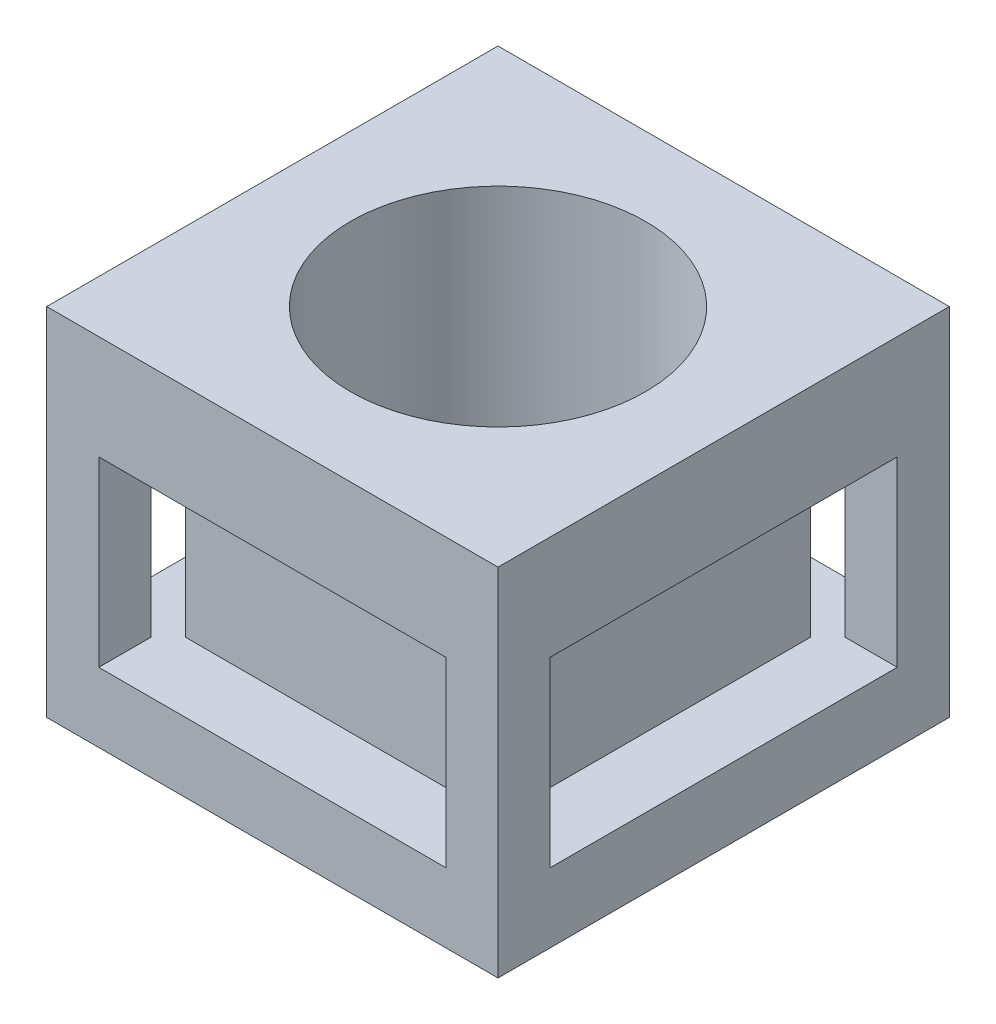
ISO-10303-21;
HEADER;
FILE_DESCRIPTION(('STEP AP214'),'2;1');
FILE_NAME('part.step','',(''),(''),'','','');
FILE_SCHEMA(('AUTOMOTIVE_DESIGN { 1 0 10303 214 1 1 1 1 }'));
ENDSEC;
DATA;
#1=APPLICATION_CONTEXT('core data for automotive mechanical design processes');
#2=APPLICATION_PROTOCOL_DEFINITION('international standard','automotive_design',2000,#1);
#3=PRODUCT_CONTEXT('',#1,'mechanical');
#4=PRODUCT('Part','Part','',(#3));
#5=PRODUCT_RELATED_PRODUCT_CATEGORY('part','',(#4));
#6=PRODUCT_DEFINITION_FORMATION('','',#4);
#7=PRODUCT_DEFINITION_CONTEXT('part definition',#1,'design');
#8=PRODUCT_DEFINITION('design','',#6,#7);
#9=PRODUCT_DEFINITION_SHAPE('','',#8);
#10=(LENGTH_UNIT() NAMED_UNIT(*) SI_UNIT(.MILLI.,.METRE.));
#11=(NAMED_UNIT(*) PLANE_ANGLE_UNIT() SI_UNIT($,.RADIAN.));
#12=(NAMED_UNIT(*) SI_UNIT($,.STERADIAN.) SOLID_ANGLE_UNIT());
#13=UNCERTAINTY_MEASURE_WITH_UNIT(LENGTH_MEASURE(1.E-05),#10,'distance_accuracy_value','');
#14=(GEOMETRIC_REPRESENTATION_CONTEXT(3) GLOBAL_UNCERTAINTY_ASSIGNED_CONTEXT((#13)) GLOBAL_UNIT_ASSIGNED_CONTEXT((#10,
#11,#12)) REPRESENTATION_CONTEXT('',''));
#15=CARTESIAN_POINT('',(0.,0.,0.));
#16=DIRECTION('',(0.,0.,1.));
#17=DIRECTION('',(1.,0.,0.));
#18=AXIS2_PLACEMENT_3D('',#15,#16,#17);
#19=CARTESIAN_POINT('',(0.,0.,26.));
#20=DIRECTION('',(1.,0.,0.));
#21=DIRECTION('',(0.,0.,-1.));
#22=AXIS2_PLACEMENT_3D('',#19,#20,#21);
#23=PLANE('',#22);
#24=DIRECTION('',(0.,0.,-1.));
#25=VECTOR('',#24,1.);
#26=CARTESIAN_POINT('',(1.04083408558608E-13,14.5,23.0000000000001));
#27=LINE('',#26,#25);
#28=CARTESIAN_POINT('',(1.04083408558608E-13,14.5,23.0000000000001));
#29=VERTEX_POINT('',#28);
#30=CARTESIAN_POINT('',(0.,14.5,3.00000000000014));
#31=VERTEX_POINT('',#30);
#32=EDGE_CURVE('E47',#29,#31,#27,.T.);
#33=ORIENTED_EDGE('',*,*,#32,.F.);
#34=DIRECTION('',(0.,1.,0.));
#35=VECTOR('',#34,1.);
#36=CARTESIAN_POINT('',(1.04083408558608E-13,14.5,23.0000000000001));
#37=LINE('',#36,#35);
#38=CARTESIAN_POINT('',(1.04083408558608E-13,4.,23.0000000000001));
#39=VERTEX_POINT('',#38);
#40=EDGE_CURVE('E182',#39,#29,#37,.T.);
#41=ORIENTED_EDGE('',*,*,#40,.F.);
#42=DIRECTION('',(0.,0.,1.));
#43=VECTOR('',#42,1.);
#44=CARTESIAN_POINT('',(1.04083408558608E-13,4.,23.0000000000001));
#45=LINE('',#44,#43);
#46=CARTESIAN_POINT('',(-1.04083408558608E-13,4.,3.00000000000014));
#47=VERTEX_POINT('',#46);
#48=EDGE_CURVE('E195',#47,#39,#45,.T.);
#49=ORIENTED_EDGE('',*,*,#48,.F.);
#50=DIRECTION('',(0.,-1.,0.));
#51=VECTOR('',#50,1.);
#52=CARTESIAN_POINT('',(-1.04083408558608E-13,14.5,3.00000000000014));
#53=LINE('',#52,#51);
#54=EDGE_CURVE('E193',#31,#47,#53,.T.);
#55=ORIENTED_EDGE('',*,*,#54,.F.);
#56=EDGE_LOOP('',(#33,#41,#49,#55));
#57=FACE_BOUND('',#56,.T.);
#58=DIRECTION('',(0.,-1.,0.));
#59=VECTOR('',#58,1.);
#60=CARTESIAN_POINT('',(0.,0.,0.));
#61=LINE('',#60,#59);
#62=CARTESIAN_POINT('',(0.,20.5,0.));
#63=VERTEX_POINT('',#62);
#64=CARTESIAN_POINT('',(0.,0.,0.));
#65=VERTEX_POINT('',#64);
#66=EDGE_CURVE('E300',#63,#65,#61,.T.);
#67=ORIENTED_EDGE('',*,*,#66,.T.);
#68=DIRECTION('',(0.,0.,-1.));
#69=VECTOR('',#68,1.);
#70=CARTESIAN_POINT('',(0.,0.,26.));
#71=LINE('',#70,#69);
#72=CARTESIAN_POINT('',(0.,0.,26.));
#73=VERTEX_POINT('',#72);
#74=EDGE_CURVE('E330',#73,#65,#71,.T.);
#75=ORIENTED_EDGE('',*,*,#74,.F.);
#76=DIRECTION('',(0.,-1.,0.));
#77=VECTOR('',#76,1.);
#78=CARTESIAN_POINT('',(0.,0.,26.));
#79=LINE('',#78,#77);
#80=CARTESIAN_POINT('',(0.,20.5,26.));
#81=VERTEX_POINT('',#80);
#82=EDGE_CURVE('E304',#81,#73,#79,.T.);
#83=ORIENTED_EDGE('',*,*,#82,.F.);
#84=DIRECTION('',(0.,0.,-1.));
#85=VECTOR('',#84,1.);
#86=CARTESIAN_POINT('',(0.,20.5,26.));
#87=LINE('',#86,#85);
#88=EDGE_CURVE('E314',#81,#63,#87,.T.);
#89=ORIENTED_EDGE('',*,*,#88,.T.);
#90=EDGE_LOOP('',(#67,#75,#83,#89));
#91=FACE_BOUND('',#90,.T.);
#92=ADVANCED_FACE('F33',(#57,#91),#23,.F.);
#93=CARTESIAN_POINT('',(0.,0.,26.));
#94=DIRECTION('',(0.,1.,0.));
#95=DIRECTION('',(0.,0.,1.));
#96=AXIS2_PLACEMENT_3D('',#93,#94,#95);
#97=PLANE('',#96);
#98=CARTESIAN_POINT('',(13.,0.,13.));
#99=DIRECTION('',(0.,-1.,0.));
#100=DIRECTION('',(0.,0.,-1.));
#101=AXIS2_PLACEMENT_3D('',#98,#99,#100);
#102=CIRCLE('',#101,3.98977204653095);
#103=CARTESIAN_POINT('',(13.,0.,9.01022795346905));
#104=VERTEX_POINT('',#103);
#105=EDGE_CURVE('E289',#104,#104,#102,.T.);
#106=ORIENTED_EDGE('',*,*,#105,.F.);
#107=EDGE_LOOP('',(#106));
#108=FACE_BOUND('',#107,.T.);
#109=DIRECTION('',(1.,0.,0.));
#110=VECTOR('',#109,1.);
#111=CARTESIAN_POINT('',(0.,0.,0.));
#112=LINE('',#111,#110);
#113=CARTESIAN_POINT('',(26.,0.,0.));
#114=VERTEX_POINT('',#113);
#115=EDGE_CURVE('E317',#65,#114,#112,.T.);
#116=ORIENTED_EDGE('',*,*,#115,.T.);
#117=DIRECTION('',(0.,0.,-1.));
#118=VECTOR('',#117,1.);
#119=CARTESIAN_POINT('',(26.,0.,26.));
#120=LINE('',#119,#118);
#121=CARTESIAN_POINT('',(26.,0.,26.));
#122=VERTEX_POINT('',#121);
#123=EDGE_CURVE('E327',#122,#114,#120,.T.);
#124=ORIENTED_EDGE('',*,*,#123,.F.);
#125=DIRECTION('',(1.,0.,0.));
#126=VECTOR('',#125,1.);
#127=CARTESIAN_POINT('',(0.,0.,26.));
#128=LINE('',#127,#126);
#129=EDGE_CURVE('E307',#73,#122,#128,.T.);
#130=ORIENTED_EDGE('',*,*,#129,.F.);
#131=ORIENTED_EDGE('',*,*,#74,.T.);
#132=EDGE_LOOP('',(#116,#124,#130,#131));
#133=FACE_BOUND('',#132,.T.);
#134=ADVANCED_FACE('F367',(#108,#133),#97,.F.);
#135=CARTESIAN_POINT('',(26.,0.,26.));
#136=DIRECTION('',(-1.,0.,0.));
#137=DIRECTION('',(0.,0.,1.));
#138=AXIS2_PLACEMENT_3D('',#135,#136,#137);
#139=PLANE('',#138);
#140=DIRECTION('',(0.,0.,1.));
#141=VECTOR('',#140,1.);
#142=CARTESIAN_POINT('',(26.,14.5,2.99999999999995));
#143=LINE('',#142,#141);
#144=CARTESIAN_POINT('',(26.,14.5,2.99999999999996));
#145=VERTEX_POINT('',#144);
#146=CARTESIAN_POINT('',(26.,14.5,22.9999999999999));
#147=VERTEX_POINT('',#146);
#148=EDGE_CURVE('E246',#145,#147,#143,.T.);
#149=ORIENTED_EDGE('',*,*,#148,.F.);
#150=DIRECTION('',(0.,1.,0.));
#151=VECTOR('',#150,1.);
#152=CARTESIAN_POINT('',(26.,14.5,2.99999999999995));
#153=LINE('',#152,#151);
#154=CARTESIAN_POINT('',(26.,4.,2.99999999999995));
#155=VERTEX_POINT('',#154);
#156=EDGE_CURVE('E55',#155,#145,#153,.T.);
#157=ORIENTED_EDGE('',*,*,#156,.F.);
#158=DIRECTION('',(0.,0.,-1.));
#159=VECTOR('',#158,1.);
#160=CARTESIAN_POINT('',(26.,4.,2.99999999999995));
#161=LINE('',#160,#159);
#162=CARTESIAN_POINT('',(26.,4.,22.9999999999999));
#163=VERTEX_POINT('',#162);
#164=EDGE_CURVE('E242',#163,#155,#161,.T.);
#165=ORIENTED_EDGE('',*,*,#164,.F.);
#166=DIRECTION('',(0.,-1.,0.));
#167=VECTOR('',#166,1.);
#168=CARTESIAN_POINT('',(26.,14.5,22.9999999999999));
#169=LINE('',#168,#167);
#170=EDGE_CURVE('E249',#147,#163,#169,.T.);
#171=ORIENTED_EDGE('',*,*,#170,.F.);
#172=EDGE_LOOP('',(#149,#157,#165,#171));
#173=FACE_BOUND('',#172,.T.);
#174=DIRECTION('',(0.,1.,0.));
#175=VECTOR('',#174,1.);
#176=CARTESIAN_POINT('',(26.,0.,0.));
#177=LINE('',#176,#175);
#178=CARTESIAN_POINT('',(26.,20.5,0.));
#179=VERTEX_POINT('',#178);
#180=EDGE_CURVE('E319',#114,#179,#177,.T.);
#181=ORIENTED_EDGE('',*,*,#180,.T.);
#182=DIRECTION('',(0.,0.,-1.));
#183=VECTOR('',#182,1.);
#184=CARTESIAN_POINT('',(26.,20.5,26.));
#185=LINE('',#184,#183);
#186=CARTESIAN_POINT('',(26.,20.5,26.));
#187=VERTEX_POINT('',#186);
#188=EDGE_CURVE('E324',#187,#179,#185,.T.);
#189=ORIENTED_EDGE('',*,*,#188,.F.);
#190=DIRECTION('',(0.,1.,0.));
#191=VECTOR('',#190,1.);
#192=CARTESIAN_POINT('',(26.,0.,26.));
#193=LINE('',#192,#191);
#194=EDGE_CURVE('E310',#122,#187,#193,.T.);
#195=ORIENTED_EDGE('',*,*,#194,.F.);
#196=ORIENTED_EDGE('',*,*,#123,.T.);
#197=EDGE_LOOP('',(#181,#189,#195,#196));
#198=FACE_BOUND('',#197,.T.);
#199=ADVANCED_FACE('F371',(#173,#198),#139,.F.);
#200=CARTESIAN_POINT('',(0.,20.5,26.));
#201=DIRECTION('',(0.,-1.,0.));
#202=DIRECTION('',(0.,0.,-1.));
#203=AXIS2_PLACEMENT_3D('',#200,#201,#202);
#204=PLANE('',#203);
#205=CARTESIAN_POINT('',(13.,20.5,13.));
#206=DIRECTION('',(0.,1.,0.));
#207=DIRECTION('',(0.,0.,1.));
#208=AXIS2_PLACEMENT_3D('',#205,#206,#207);
#209=CIRCLE('',#208,8.5);
#210=CARTESIAN_POINT('',(13.,20.5,21.5));
#211=VERTEX_POINT('',#210);
#212=EDGE_CURVE('E301',#211,#211,#209,.T.);
#213=ORIENTED_EDGE('',*,*,#212,.F.);
#214=EDGE_LOOP('',(#213));
#215=FACE_BOUND('',#214,.T.);
#216=DIRECTION('',(-1.,0.,0.));
#217=VECTOR('',#216,1.);
#218=CARTESIAN_POINT('',(0.,20.5,0.));
#219=LINE('',#218,#217);
#220=EDGE_CURVE('E308',#179,#63,#219,.T.);
#221=ORIENTED_EDGE('',*,*,#220,.T.);
#222=ORIENTED_EDGE('',*,*,#88,.F.);
#223=DIRECTION('',(-1.,0.,0.));
#224=VECTOR('',#223,1.);
#225=CARTESIAN_POINT('',(0.,20.5,26.));
#226=LINE('',#225,#224);
#227=EDGE_CURVE('E312',#187,#81,#226,.T.);
#228=ORIENTED_EDGE('',*,*,#227,.F.);
#229=ORIENTED_EDGE('',*,*,#188,.T.);
#230=EDGE_LOOP('',(#221,#222,#228,#229));
#231=FACE_BOUND('',#230,.T.);
#232=ADVANCED_FACE('F376',(#215,#231),#204,.F.);
#233=CARTESIAN_POINT('',(0.,0.,26.));
#234=DIRECTION('',(0.,0.,-1.));
#235=DIRECTION('',(-1.,0.,0.));
#236=AXIS2_PLACEMENT_3D('',#233,#234,#235);
#237=PLANE('',#236);
#238=DIRECTION('',(-1.,0.,0.));
#239=VECTOR('',#238,1.);
#240=CARTESIAN_POINT('',(23.,14.5,26.));
#241=LINE('',#240,#239);
#242=CARTESIAN_POINT('',(23.,14.5,26.));
#243=VERTEX_POINT('',#242);
#244=CARTESIAN_POINT('',(3.00000000000001,14.5,26.));
#245=VERTEX_POINT('',#244);
#246=EDGE_CURVE('E280',#243,#245,#241,.T.);
#247=ORIENTED_EDGE('',*,*,#246,.F.);
#248=DIRECTION('',(0.,1.,0.));
#249=VECTOR('',#248,1.);
#250=CARTESIAN_POINT('',(23.,14.5,26.));
#251=LINE('',#250,#249);
#252=CARTESIAN_POINT('',(23.,4.,26.));
#253=VERTEX_POINT('',#252);
#254=EDGE_CURVE('E269',#253,#243,#251,.T.);
#255=ORIENTED_EDGE('',*,*,#254,.F.);
#256=DIRECTION('',(1.,0.,0.));
#257=VECTOR('',#256,1.);
#258=CARTESIAN_POINT('',(23.,4.,26.));
#259=LINE('',#258,#257);
#260=CARTESIAN_POINT('',(3.00000000000001,4.,26.));
#261=VERTEX_POINT('',#260);
#262=EDGE_CURVE('E274',#261,#253,#259,.T.);
#263=ORIENTED_EDGE('',*,*,#262,.F.);
#264=DIRECTION('',(0.,-1.,0.));
#265=VECTOR('',#264,1.);
#266=CARTESIAN_POINT('',(3.00000000000001,14.5,26.));
#267=LINE('',#266,#265);
#268=EDGE_CURVE('E282',#245,#261,#267,.T.);
#269=ORIENTED_EDGE('',*,*,#268,.F.);
#270=EDGE_LOOP('',(#247,#255,#263,#269));
#271=FACE_BOUND('',#270,.T.);
#272=ORIENTED_EDGE('',*,*,#82,.T.);
#273=ORIENTED_EDGE('',*,*,#129,.T.);
#274=ORIENTED_EDGE('',*,*,#194,.T.);
#275=ORIENTED_EDGE('',*,*,#227,.T.);
#276=EDGE_LOOP('',(#272,#273,#274,#275));
#277=FACE_BOUND('',#276,.T.);
#278=ADVANCED_FACE('F384',(#271,#277),#237,.F.);
#279=CARTESIAN_POINT('',(0.,0.,0.));
#280=DIRECTION('',(0.,0.,-1.));
#281=DIRECTION('',(-1.,0.,0.));
#282=AXIS2_PLACEMENT_3D('',#279,#280,#281);
#283=PLANE('',#282);
#284=DIRECTION('',(0.,1.,0.));
#285=VECTOR('',#284,1.);
#286=CARTESIAN_POINT('',(3.,14.5,0.));
#287=LINE('',#286,#285);
#288=CARTESIAN_POINT('',(3.,4.,0.));
#289=VERTEX_POINT('',#288);
#290=CARTESIAN_POINT('',(3.,14.5,0.));
#291=VERTEX_POINT('',#290);
#292=EDGE_CURVE('E208',#289,#291,#287,.T.);
#293=ORIENTED_EDGE('',*,*,#292,.F.);
#294=DIRECTION('',(-1.,0.,0.));
#295=VECTOR('',#294,1.);
#296=CARTESIAN_POINT('',(3.,4.,0.));
#297=LINE('',#296,#295);
#298=CARTESIAN_POINT('',(23.,4.,0.));
#299=VERTEX_POINT('',#298);
#300=EDGE_CURVE('E213',#299,#289,#297,.T.);
#301=ORIENTED_EDGE('',*,*,#300,.F.);
#302=DIRECTION('',(0.,-1.,0.));
#303=VECTOR('',#302,1.);
#304=CARTESIAN_POINT('',(23.,14.5,0.));
#305=LINE('',#304,#303);
#306=CARTESIAN_POINT('',(23.,14.5,0.));
#307=VERTEX_POINT('',#306);
#308=EDGE_CURVE('E220',#307,#299,#305,.T.);
#309=ORIENTED_EDGE('',*,*,#308,.F.);
#310=DIRECTION('',(1.,0.,0.));
#311=VECTOR('',#310,1.);
#312=CARTESIAN_POINT('',(3.,14.5,0.));
#313=LINE('',#312,#311);
#314=EDGE_CURVE('E218',#291,#307,#313,.T.);
#315=ORIENTED_EDGE('',*,*,#314,.F.);
#316=EDGE_LOOP('',(#293,#301,#309,#315));
#317=FACE_BOUND('',#316,.T.);
#318=ORIENTED_EDGE('',*,*,#66,.F.);
#319=ORIENTED_EDGE('',*,*,#220,.F.);
#320=ORIENTED_EDGE('',*,*,#180,.F.);
#321=ORIENTED_EDGE('',*,*,#115,.F.);
#322=EDGE_LOOP('',(#318,#319,#320,#321));
#323=FACE_BOUND('',#322,.T.);
#324=ADVANCED_FACE('F386',(#317,#323),#283,.T.);
#325=CARTESIAN_POINT('',(13.,8.,13.));
#326=DIRECTION('',(0.,1.,0.));
#327=DIRECTION('',(0.,0.,1.));
#328=AXIS2_PLACEMENT_3D('',#325,#326,#327);
#329=CYLINDRICAL_SURFACE('',#328,8.5);
#330=CARTESIAN_POINT('',(13.,8.,13.));
#331=DIRECTION('',(0.,1.,0.));
#332=DIRECTION('',(0.,0.,1.));
#333=AXIS2_PLACEMENT_3D('',#330,#331,#332);
#334=CIRCLE('',#333,8.5);
#335=CARTESIAN_POINT('',(13.,8.,21.5));
#336=VERTEX_POINT('',#335);
#337=EDGE_CURVE('E297',#336,#336,#334,.T.);
#338=ORIENTED_EDGE('',*,*,#337,.F.);
#339=EDGE_LOOP('',(#338));
#340=FACE_BOUND('',#339,.T.);
#341=ORIENTED_EDGE('',*,*,#212,.T.);
#342=EDGE_LOOP('',(#341));
#343=FACE_BOUND('',#342,.T.);
#344=ADVANCED_FACE('F389',(#340,#343),#329,.F.);
#345=CARTESIAN_POINT('',(13.,8.,13.));
#346=DIRECTION('',(0.,1.,0.));
#347=DIRECTION('',(0.,0.,1.));
#348=AXIS2_PLACEMENT_3D('',#345,#346,#347);
#349=PLANE('',#348);
#350=CARTESIAN_POINT('',(13.,8.,13.));
#351=DIRECTION('',(0.,1.,0.));
#352=DIRECTION('',(0.,0.,1.));
#353=AXIS2_PLACEMENT_3D('',#350,#351,#352);
#354=CIRCLE('',#353,3.98977204653095);
#355=CARTESIAN_POINT('',(13.,8.,16.989772046531));
#356=VERTEX_POINT('',#355);
#357=EDGE_CURVE('E296',#356,#356,#354,.T.);
#358=ORIENTED_EDGE('',*,*,#357,.F.);
#359=EDGE_LOOP('',(#358));
#360=FACE_BOUND('',#359,.T.);
#361=ORIENTED_EDGE('',*,*,#337,.T.);
#362=EDGE_LOOP('',(#361));
#363=FACE_BOUND('',#362,.T.);
#364=ADVANCED_FACE('F396',(#360,#363),#349,.T.);
#365=CARTESIAN_POINT('',(13.,20.5,13.));
#366=DIRECTION('',(0.,-1.,0.));
#367=DIRECTION('',(0.,0.,-1.));
#368=AXIS2_PLACEMENT_3D('',#365,#366,#367);
#369=CYLINDRICAL_SURFACE('',#368,3.98977204653095);
#370=ORIENTED_EDGE('',*,*,#357,.T.);
#371=EDGE_LOOP('',(#370));
#372=FACE_BOUND('',#371,.T.);
#373=ORIENTED_EDGE('',*,*,#105,.T.);
#374=EDGE_LOOP('',(#373));
#375=FACE_BOUND('',#374,.T.);
#376=ADVANCED_FACE('F400',(#372,#375),#369,.F.);
#377=CARTESIAN_POINT('',(23.,14.5,22.));
#378=DIRECTION('',(1.,0.,0.));
#379=DIRECTION('',(0.,0.,-1.));
#380=AXIS2_PLACEMENT_3D('',#377,#378,#379);
#381=PLANE('',#380);
#382=DIRECTION('',(0.,0.,1.));
#383=VECTOR('',#382,1.);
#384=CARTESIAN_POINT('',(23.,14.5,22.));
#385=LINE('',#384,#383);
#386=CARTESIAN_POINT('',(23.,14.5,23.));
#387=VERTEX_POINT('',#386);
#388=EDGE_CURVE('E277',#387,#243,#385,.T.);
#389=ORIENTED_EDGE('',*,*,#388,.F.);
#390=DIRECTION('',(0.,-1.,0.));
#391=VECTOR('',#390,1.);
#392=CARTESIAN_POINT('',(23.,14.5,23.));
#393=LINE('',#392,#391);
#394=CARTESIAN_POINT('',(23.,4.,23.));
#395=VERTEX_POINT('',#394);
#396=EDGE_CURVE('E266',#387,#395,#393,.T.);
#397=ORIENTED_EDGE('',*,*,#396,.T.);
#398=DIRECTION('',(0.,0.,1.));
#399=VECTOR('',#398,1.);
#400=CARTESIAN_POINT('',(23.,4.,22.));
#401=LINE('',#400,#399);
#402=EDGE_CURVE('E287',#395,#253,#401,.T.);
#403=ORIENTED_EDGE('',*,*,#402,.T.);
#404=ORIENTED_EDGE('',*,*,#254,.T.);
#405=EDGE_LOOP('',(#389,#397,#403,#404));
#406=FACE_BOUND('',#405,.T.);
#407=ADVANCED_FACE('F404',(#406),#381,.F.);
#408=CARTESIAN_POINT('',(23.,4.,22.));
#409=DIRECTION('',(0.,-1.,0.));
#410=DIRECTION('',(1.,0.,0.));
#411=AXIS2_PLACEMENT_3D('',#408,#409,#410);
#412=PLANE('',#411);
#413=ORIENTED_EDGE('',*,*,#402,.F.);
#414=DIRECTION('',(1.,0.,0.));
#415=VECTOR('',#414,1.);
#416=CARTESIAN_POINT('',(22.,4.,23.));
#417=LINE('',#416,#415);
#418=EDGE_CURVE('E257',#395,#163,#417,.T.);
#419=ORIENTED_EDGE('',*,*,#418,.T.);
#420=ORIENTED_EDGE('',*,*,#164,.T.);
#421=DIRECTION('',(1.,0.,0.));
#422=VECTOR('',#421,1.);
#423=CARTESIAN_POINT('',(22.,4.,2.99999999999997));
#424=LINE('',#423,#422);
#425=CARTESIAN_POINT('',(23.,4.,2.99999999999996));
#426=VERTEX_POINT('',#425);
#427=EDGE_CURVE('E254',#426,#155,#424,.T.);
#428=ORIENTED_EDGE('',*,*,#427,.F.);
#429=DIRECTION('',(0.,0.,-1.));
#430=VECTOR('',#429,1.);
#431=CARTESIAN_POINT('',(23.,4.,4.));
#432=LINE('',#431,#430);
#433=EDGE_CURVE('E228',#426,#299,#432,.T.);
#434=ORIENTED_EDGE('',*,*,#433,.T.);
#435=ORIENTED_EDGE('',*,*,#300,.T.);
#436=DIRECTION('',(0.,0.,-1.));
#437=VECTOR('',#436,1.);
#438=CARTESIAN_POINT('',(3.,4.,4.));
#439=LINE('',#438,#437);
#440=CARTESIAN_POINT('',(3.,4.,3.0000000000001));
#441=VERTEX_POINT('',#440);
#442=EDGE_CURVE('E225',#441,#289,#439,.T.);
#443=ORIENTED_EDGE('',*,*,#442,.F.);
#444=DIRECTION('',(-1.,0.,0.));
#445=VECTOR('',#444,1.);
#446=CARTESIAN_POINT('',(3.9999999999999,4.,3.0000000000001));
#447=LINE('',#446,#445);
#448=EDGE_CURVE('E203',#441,#47,#447,.T.);
#449=ORIENTED_EDGE('',*,*,#448,.T.);
#450=ORIENTED_EDGE('',*,*,#48,.T.);
#451=DIRECTION('',(-1.,0.,0.));
#452=VECTOR('',#451,1.);
#453=CARTESIAN_POINT('',(4.0000000000001,4.,23.0000000000001));
#454=LINE('',#453,#452);
#455=CARTESIAN_POINT('',(3.00000000000001,4.,23.0000000000001));
#456=VERTEX_POINT('',#455);
#457=EDGE_CURVE('E185',#456,#39,#454,.T.);
#458=ORIENTED_EDGE('',*,*,#457,.F.);
#459=DIRECTION('',(0.,0.,1.));
#460=VECTOR('',#459,1.);
#461=CARTESIAN_POINT('',(3.00000000000001,4.,22.));
#462=LINE('',#461,#460);
#463=EDGE_CURVE('E290',#456,#261,#462,.T.);
#464=ORIENTED_EDGE('',*,*,#463,.T.);
#465=ORIENTED_EDGE('',*,*,#262,.T.);
#466=EDGE_LOOP('',(#413,#419,#420,#428,#434,#435,#443,#449,#450,#458,#464,#465));
#467=FACE_BOUND('',#466,.T.);
#468=DIRECTION('',(0.,0.,-1.));
#469=VECTOR('',#468,1.);
#470=CARTESIAN_POINT('',(22.,4.,2.99999999999997));
#471=LINE('',#470,#469);
#472=CARTESIAN_POINT('',(22.,4.,22.));
#473=VERTEX_POINT('',#472);
#474=CARTESIAN_POINT('',(22.,4.,4.));
#475=VERTEX_POINT('',#474);
#476=EDGE_CURVE('E241',#473,#475,#471,.T.);
#477=ORIENTED_EDGE('',*,*,#476,.F.);
#478=DIRECTION('',(1.,0.,0.));
#479=VECTOR('',#478,1.);
#480=CARTESIAN_POINT('',(23.,4.,22.));
#481=LINE('',#480,#479);
#482=CARTESIAN_POINT('',(4.00000000000009,4.,22.));
#483=VERTEX_POINT('',#482);
#484=EDGE_CURVE('E273',#483,#473,#481,.T.);
#485=ORIENTED_EDGE('',*,*,#484,.F.);
#486=DIRECTION('',(0.,0.,1.));
#487=VECTOR('',#486,1.);
#488=CARTESIAN_POINT('',(4.0000000000001,4.,23.0000000000001));
#489=LINE('',#488,#487);
#490=CARTESIAN_POINT('',(3.99999999999991,4.,4.));
#491=VERTEX_POINT('',#490);
#492=EDGE_CURVE('E179',#491,#483,#489,.T.);
#493=ORIENTED_EDGE('',*,*,#492,.F.);
#494=DIRECTION('',(-1.,0.,0.));
#495=VECTOR('',#494,1.);
#496=CARTESIAN_POINT('',(3.,4.,4.));
#497=LINE('',#496,#495);
#498=EDGE_CURVE('E212',#475,#491,#497,.T.);
#499=ORIENTED_EDGE('',*,*,#498,.F.);
#500=EDGE_LOOP('',(#477,#485,#493,#499));
#501=FACE_BOUND('',#500,.T.);
#502=ADVANCED_FACE('F344',(#467,#501),#412,.F.);
#503=CARTESIAN_POINT('',(3.00000000000001,14.5,22.));
#504=DIRECTION('',(-1.,0.,0.));
#505=DIRECTION('',(0.,-1.,0.));
#506=AXIS2_PLACEMENT_3D('',#503,#504,#505);
#507=PLANE('',#506);
#508=ORIENTED_EDGE('',*,*,#463,.F.);
#509=DIRECTION('',(0.,1.,0.));
#510=VECTOR('',#509,1.);
#511=CARTESIAN_POINT('',(3.00000000000001,14.5,23.0000000000001));
#512=LINE('',#511,#510);
#513=CARTESIAN_POINT('',(3.00000000000001,14.5,23.0000000000001));
#514=VERTEX_POINT('',#513);
#515=EDGE_CURVE('E264',#456,#514,#512,.T.);
#516=ORIENTED_EDGE('',*,*,#515,.T.);
#517=DIRECTION('',(0.,0.,1.));
#518=VECTOR('',#517,1.);
#519=CARTESIAN_POINT('',(3.00000000000001,14.5,22.));
#520=LINE('',#519,#518);
#521=EDGE_CURVE('E175',#514,#245,#520,.T.);
#522=ORIENTED_EDGE('',*,*,#521,.T.);
#523=ORIENTED_EDGE('',*,*,#268,.T.);
#524=EDGE_LOOP('',(#508,#516,#522,#523));
#525=FACE_BOUND('',#524,.T.);
#526=ADVANCED_FACE('F411',(#525),#507,.F.);
#527=CARTESIAN_POINT('',(23.,14.5,22.));
#528=DIRECTION('',(0.,1.,0.));
#529=DIRECTION('',(0.,0.,1.));
#530=AXIS2_PLACEMENT_3D('',#527,#528,#529);
#531=PLANE('',#530);
#532=DIRECTION('',(1.,0.,0.));
#533=VECTOR('',#532,1.);
#534=CARTESIAN_POINT('',(22.,14.5,23.));
#535=LINE('',#534,#533);
#536=EDGE_CURVE('E259',#387,#147,#535,.T.);
#537=ORIENTED_EDGE('',*,*,#536,.F.);
#538=ORIENTED_EDGE('',*,*,#388,.T.);
#539=ORIENTED_EDGE('',*,*,#246,.T.);
#540=ORIENTED_EDGE('',*,*,#521,.F.);
#541=DIRECTION('',(-1.,0.,0.));
#542=VECTOR('',#541,1.);
#543=CARTESIAN_POINT('',(4.0000000000001,14.5,23.0000000000001));
#544=LINE('',#543,#542);
#545=EDGE_CURVE('E169',#514,#29,#544,.T.);
#546=ORIENTED_EDGE('',*,*,#545,.T.);
#547=ORIENTED_EDGE('',*,*,#32,.T.);
#548=DIRECTION('',(-1.,0.,0.));
#549=VECTOR('',#548,1.);
#550=CARTESIAN_POINT('',(3.9999999999999,14.5,3.0000000000001));
#551=LINE('',#550,#549);
#552=CARTESIAN_POINT('',(3.,14.5,3.00000000000011));
#553=VERTEX_POINT('',#552);
#554=EDGE_CURVE('E178',#553,#31,#551,.T.);
#555=ORIENTED_EDGE('',*,*,#554,.F.);
#556=DIRECTION('',(0.,0.,-1.));
#557=VECTOR('',#556,1.);
#558=CARTESIAN_POINT('',(3.,14.5,4.));
#559=LINE('',#558,#557);
#560=EDGE_CURVE('E215',#553,#291,#559,.T.);
#561=ORIENTED_EDGE('',*,*,#560,.T.);
#562=ORIENTED_EDGE('',*,*,#314,.T.);
#563=DIRECTION('',(0.,0.,-1.));
#564=VECTOR('',#563,1.);
#565=CARTESIAN_POINT('',(23.,14.5,4.));
#566=LINE('',#565,#564);
#567=CARTESIAN_POINT('',(23.,14.5,2.99999999999996));
#568=VERTEX_POINT('',#567);
#569=EDGE_CURVE('E230',#568,#307,#566,.T.);
#570=ORIENTED_EDGE('',*,*,#569,.F.);
#571=DIRECTION('',(1.,0.,0.));
#572=VECTOR('',#571,1.);
#573=CARTESIAN_POINT('',(22.,14.5,2.99999999999997));
#574=LINE('',#573,#572);
#575=EDGE_CURVE('E244',#568,#145,#574,.T.);
#576=ORIENTED_EDGE('',*,*,#575,.T.);
#577=ORIENTED_EDGE('',*,*,#148,.T.);
#578=EDGE_LOOP('',(#537,#538,#539,#540,#546,#547,#555,#561,#562,#570,#576,#577));
#579=FACE_BOUND('',#578,.T.);
#580=DIRECTION('',(-1.,0.,0.));
#581=VECTOR('',#580,1.);
#582=CARTESIAN_POINT('',(23.,14.5,22.));
#583=LINE('',#582,#581);
#584=CARTESIAN_POINT('',(22.,14.5,22.));
#585=VERTEX_POINT('',#584);
#586=CARTESIAN_POINT('',(4.00000000000009,14.5,22.));
#587=VERTEX_POINT('',#586);
#588=EDGE_CURVE('E270',#585,#587,#583,.T.);
#589=ORIENTED_EDGE('',*,*,#588,.F.);
#590=DIRECTION('',(0.,0.,1.));
#591=VECTOR('',#590,1.);
#592=CARTESIAN_POINT('',(22.,14.5,2.99999999999997));
#593=LINE('',#592,#591);
#594=CARTESIAN_POINT('',(22.,14.5,4.));
#595=VERTEX_POINT('',#594);
#596=EDGE_CURVE('E239',#595,#585,#593,.T.);
#597=ORIENTED_EDGE('',*,*,#596,.F.);
#598=DIRECTION('',(1.,0.,0.));
#599=VECTOR('',#598,1.);
#600=CARTESIAN_POINT('',(3.,14.5,4.));
#601=LINE('',#600,#599);
#602=CARTESIAN_POINT('',(3.99999999999991,14.5,4.));
#603=VERTEX_POINT('',#602);
#604=EDGE_CURVE('E209',#603,#595,#601,.T.);
#605=ORIENTED_EDGE('',*,*,#604,.F.);
#606=DIRECTION('',(0.,0.,-1.));
#607=VECTOR('',#606,1.);
#608=CARTESIAN_POINT('',(4.0000000000001,14.5,23.0000000000001));
#609=LINE('',#608,#607);
#610=EDGE_CURVE('E200',#587,#603,#609,.T.);
#611=ORIENTED_EDGE('',*,*,#610,.F.);
#612=EDGE_LOOP('',(#589,#597,#605,#611));
#613=FACE_BOUND('',#612,.T.);
#614=ADVANCED_FACE('F172',(#579,#613),#531,.F.);
#615=CARTESIAN_POINT('',(0.,0.,22.));
#616=DIRECTION('',(0.,0.,-1.));
#617=DIRECTION('',(-1.,0.,0.));
#618=AXIS2_PLACEMENT_3D('',#615,#616,#617);
#619=PLANE('',#618);
#620=ORIENTED_EDGE('',*,*,#484,.T.);
#621=DIRECTION('',(0.,1.,0.));
#622=VECTOR('',#621,1.);
#623=CARTESIAN_POINT('',(22.,0.,22.));
#624=LINE('',#623,#622);
#625=EDGE_CURVE('E11',#473,#585,#624,.T.);
#626=ORIENTED_EDGE('',*,*,#625,.T.);
#627=ORIENTED_EDGE('',*,*,#588,.T.);
#628=DIRECTION('',(0.,-1.,0.));
#629=VECTOR('',#628,1.);
#630=CARTESIAN_POINT('',(4.0000000000001,0.,22.));
#631=LINE('',#630,#629);
#632=EDGE_CURVE('E40',#587,#483,#631,.T.);
#633=ORIENTED_EDGE('',*,*,#632,.T.);
#634=EDGE_LOOP('',(#620,#626,#627,#633));
#635=FACE_BOUND('',#634,.T.);
#636=ADVANCED_FACE('F337',(#635),#619,.F.);
#637=CARTESIAN_POINT('',(22.,14.5,23.));
#638=DIRECTION('',(0.,0.,1.));
#639=DIRECTION('',(1.,0.,0.));
#640=AXIS2_PLACEMENT_3D('',#637,#638,#639);
#641=PLANE('',#640);
#642=ORIENTED_EDGE('',*,*,#536,.T.);
#643=ORIENTED_EDGE('',*,*,#170,.T.);
#644=ORIENTED_EDGE('',*,*,#418,.F.);
#645=ORIENTED_EDGE('',*,*,#396,.F.);
#646=EDGE_LOOP('',(#642,#643,#644,#645));
#647=FACE_BOUND('',#646,.T.);
#648=ADVANCED_FACE('F419',(#647),#641,.F.);
#649=CARTESIAN_POINT('',(4.0000000000001,14.5,23.0000000000001));
#650=DIRECTION('',(0.,0.,1.));
#651=DIRECTION('',(1.,0.,0.));
#652=AXIS2_PLACEMENT_3D('',#649,#650,#651);
#653=PLANE('',#652);
#654=ORIENTED_EDGE('',*,*,#457,.T.);
#655=ORIENTED_EDGE('',*,*,#40,.T.);
#656=ORIENTED_EDGE('',*,*,#545,.F.);
#657=ORIENTED_EDGE('',*,*,#515,.F.);
#658=EDGE_LOOP('',(#654,#655,#656,#657));
#659=FACE_BOUND('',#658,.T.);
#660=ADVANCED_FACE('F183',(#659),#653,.F.);
#661=CARTESIAN_POINT('',(22.,0.,26.));
#662=DIRECTION('',(-1.,0.,0.));
#663=DIRECTION('',(0.,0.,1.));
#664=AXIS2_PLACEMENT_3D('',#661,#662,#663);
#665=PLANE('',#664);
#666=ORIENTED_EDGE('',*,*,#476,.T.);
#667=DIRECTION('',(0.,1.,0.));
#668=VECTOR('',#667,1.);
#669=CARTESIAN_POINT('',(22.,0.,4.));
#670=LINE('',#669,#668);
#671=EDGE_CURVE('E256',#475,#595,#670,.T.);
#672=ORIENTED_EDGE('',*,*,#671,.T.);
#673=ORIENTED_EDGE('',*,*,#596,.T.);
#674=ORIENTED_EDGE('',*,*,#625,.F.);
#675=EDGE_LOOP('',(#666,#672,#673,#674));
#676=FACE_BOUND('',#675,.T.);
#677=ADVANCED_FACE('F348',(#676),#665,.F.);
#678=CARTESIAN_POINT('',(3.99999999999986,0.,0.));
#679=DIRECTION('',(1.,0.,0.));
#680=DIRECTION('',(0.,0.,-1.));
#681=AXIS2_PLACEMENT_3D('',#678,#679,#680);
#682=PLANE('',#681);
#683=ORIENTED_EDGE('',*,*,#610,.T.);
#684=DIRECTION('',(0.,1.,0.));
#685=VECTOR('',#684,1.);
#686=CARTESIAN_POINT('',(3.99999999999991,0.,4.));
#687=LINE('',#686,#685);
#688=EDGE_CURVE('E227',#491,#603,#687,.T.);
#689=ORIENTED_EDGE('',*,*,#688,.F.);
#690=ORIENTED_EDGE('',*,*,#492,.T.);
#691=ORIENTED_EDGE('',*,*,#632,.F.);
#692=EDGE_LOOP('',(#683,#689,#690,#691));
#693=FACE_BOUND('',#692,.T.);
#694=ADVANCED_FACE('F354',(#693),#682,.F.);
#695=CARTESIAN_POINT('',(22.,14.5,2.99999999999997));
#696=DIRECTION('',(0.,0.,-1.));
#697=DIRECTION('',(-1.,0.,0.));
#698=AXIS2_PLACEMENT_3D('',#695,#696,#697);
#699=PLANE('',#698);
#700=DIRECTION('',(0.,-1.,0.));
#701=VECTOR('',#700,1.);
#702=CARTESIAN_POINT('',(23.,14.5,2.99999999999996));
#703=LINE('',#702,#701);
#704=EDGE_CURVE('E236',#568,#426,#703,.T.);
#705=ORIENTED_EDGE('',*,*,#704,.T.);
#706=ORIENTED_EDGE('',*,*,#427,.T.);
#707=ORIENTED_EDGE('',*,*,#156,.T.);
#708=ORIENTED_EDGE('',*,*,#575,.F.);
#709=EDGE_LOOP('',(#705,#706,#707,#708));
#710=FACE_BOUND('',#709,.T.);
#711=ADVANCED_FACE('F356',(#710),#699,.F.);
#712=CARTESIAN_POINT('',(3.,14.5,4.));
#713=DIRECTION('',(-1.,0.,0.));
#714=DIRECTION('',(0.,-1.,0.));
#715=AXIS2_PLACEMENT_3D('',#712,#713,#714);
#716=PLANE('',#715);
#717=DIRECTION('',(0.,-1.,0.));
#718=VECTOR('',#717,1.);
#719=CARTESIAN_POINT('',(3.,14.5,3.00000000000011));
#720=LINE('',#719,#718);
#721=EDGE_CURVE('E202',#553,#441,#720,.T.);
#722=ORIENTED_EDGE('',*,*,#721,.T.);
#723=ORIENTED_EDGE('',*,*,#442,.T.);
#724=ORIENTED_EDGE('',*,*,#292,.T.);
#725=ORIENTED_EDGE('',*,*,#560,.F.);
#726=EDGE_LOOP('',(#722,#723,#724,#725));
#727=FACE_BOUND('',#726,.T.);
#728=ADVANCED_FACE('F362',(#727),#716,.F.);
#729=CARTESIAN_POINT('',(23.,14.5,4.));
#730=DIRECTION('',(1.,0.,0.));
#731=DIRECTION('',(0.,1.,0.));
#732=AXIS2_PLACEMENT_3D('',#729,#730,#731);
#733=PLANE('',#732);
#734=ORIENTED_EDGE('',*,*,#569,.T.);
#735=ORIENTED_EDGE('',*,*,#308,.T.);
#736=ORIENTED_EDGE('',*,*,#433,.F.);
#737=ORIENTED_EDGE('',*,*,#704,.F.);
#738=EDGE_LOOP('',(#734,#735,#736,#737));
#739=FACE_BOUND('',#738,.T.);
#740=ADVANCED_FACE('F426',(#739),#733,.F.);
#741=CARTESIAN_POINT('',(26.,0.,4.));
#742=DIRECTION('',(0.,0.,1.));
#743=DIRECTION('',(1.,0.,0.));
#744=AXIS2_PLACEMENT_3D('',#741,#742,#743);
#745=PLANE('',#744);
#746=ORIENTED_EDGE('',*,*,#498,.T.);
#747=ORIENTED_EDGE('',*,*,#688,.T.);
#748=ORIENTED_EDGE('',*,*,#604,.T.);
#749=ORIENTED_EDGE('',*,*,#671,.F.);
#750=EDGE_LOOP('',(#746,#747,#748,#749));
#751=FACE_BOUND('',#750,.T.);
#752=ADVANCED_FACE('F350',(#751),#745,.F.);
#753=CARTESIAN_POINT('',(3.9999999999999,14.5,3.0000000000001));
#754=DIRECTION('',(0.,0.,-1.));
#755=DIRECTION('',(-1.,0.,0.));
#756=AXIS2_PLACEMENT_3D('',#753,#754,#755);
#757=PLANE('',#756);
#758=ORIENTED_EDGE('',*,*,#554,.T.);
#759=ORIENTED_EDGE('',*,*,#54,.T.);
#760=ORIENTED_EDGE('',*,*,#448,.F.);
#761=ORIENTED_EDGE('',*,*,#721,.F.);
#762=EDGE_LOOP('',(#758,#759,#760,#761));
#763=FACE_BOUND('',#762,.T.);
#764=ADVANCED_FACE('F433',(#763),#757,.F.);
#765=CLOSED_SHELL('',(#92,#134,#199,#232,#278,#324,#344,#364,#376,#407,#502,#526,#614,#636,#648,
#660,#677,#694,#711,#728,#740,#752,#764));
#766=MANIFOLD_SOLID_BREP('B2',#765);
#767=ADVANCED_BREP_SHAPE_REPRESENTATION('',(#18,#766),#14);
#768=SHAPE_DEFINITION_REPRESENTATION(#9,#767);
ENDSEC;
END-ISO-10303-21;
